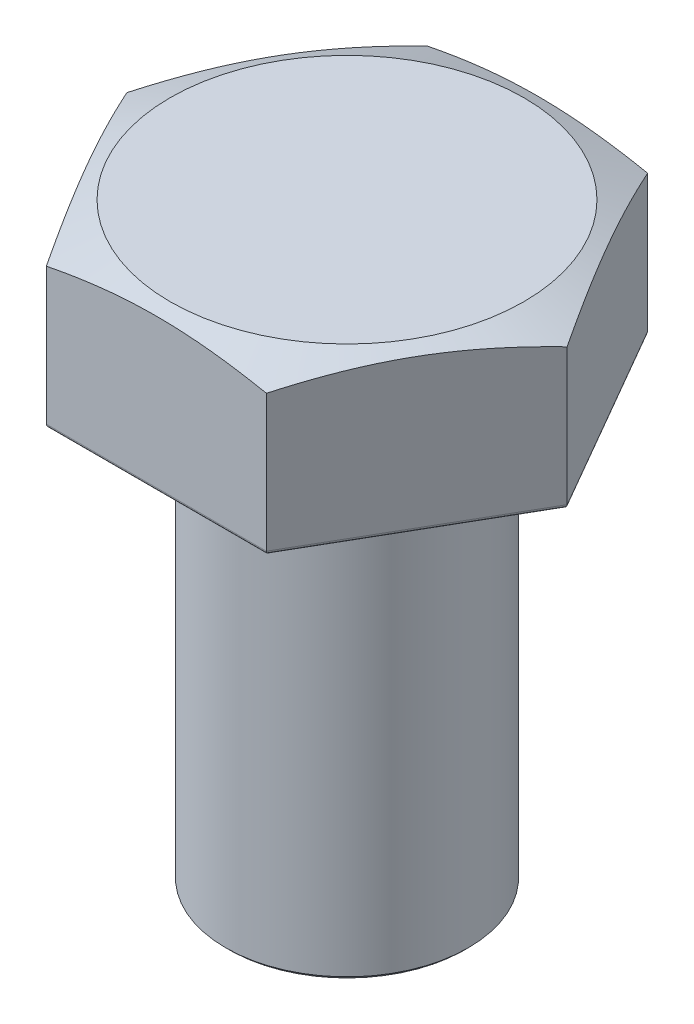
ISO-10303-21;
HEADER;
FILE_DESCRIPTION(('STEP AP214'),'2;1');
FILE_NAME('part.step','',(''),(''),'','','');
FILE_SCHEMA(('AUTOMOTIVE_DESIGN { 1 0 10303 214 1 1 1 1 }'));
ENDSEC;
DATA;
#1=APPLICATION_CONTEXT('core data for automotive mechanical design processes');
#2=APPLICATION_PROTOCOL_DEFINITION('international standard','automotive_design',2000,#1);
#3=PRODUCT_CONTEXT('',#1,'mechanical');
#4=PRODUCT('Part','Part','',(#3));
#5=PRODUCT_RELATED_PRODUCT_CATEGORY('part','',(#4));
#6=PRODUCT_DEFINITION_FORMATION('','',#4);
#7=PRODUCT_DEFINITION_CONTEXT('part definition',#1,'design');
#8=PRODUCT_DEFINITION('design','',#6,#7);
#9=PRODUCT_DEFINITION_SHAPE('','',#8);
#10=(LENGTH_UNIT() NAMED_UNIT(*) SI_UNIT(.MILLI.,.METRE.));
#11=(NAMED_UNIT(*) PLANE_ANGLE_UNIT() SI_UNIT($,.RADIAN.));
#12=(NAMED_UNIT(*) SI_UNIT($,.STERADIAN.) SOLID_ANGLE_UNIT());
#13=UNCERTAINTY_MEASURE_WITH_UNIT(LENGTH_MEASURE(1.E-05),#10,'distance_accuracy_value','');
#14=(GEOMETRIC_REPRESENTATION_CONTEXT(3) GLOBAL_UNCERTAINTY_ASSIGNED_CONTEXT((#13)) GLOBAL_UNIT_ASSIGNED_CONTEXT((#10,
#11,#12)) REPRESENTATION_CONTEXT('',''));
#15=CARTESIAN_POINT('',(0.,0.,0.));
#16=DIRECTION('',(0.,0.,1.));
#17=DIRECTION('',(1.,0.,0.));
#18=AXIS2_PLACEMENT_3D('',#15,#16,#17);
#19=CARTESIAN_POINT('',(6.35085296108599,9.09,10.9999999999999));
#20=DIRECTION('',(-0.866025403784442,0.,-0.499999999999995));
#21=DIRECTION('',(-0.499999999999995,0.,0.866025403784442));
#22=AXIS2_PLACEMENT_3D('',#19,#20,#21);
#23=PLANE('',#22);
#24=DIRECTION('',(0.,-1.,0.));
#25=VECTOR('',#24,1.);
#26=CARTESIAN_POINT('',(12.7017059221717,9.09,0.));
#27=LINE('',#26,#25);
#28=CARTESIAN_POINT('',(12.7017059221717,8.09,0.));
#29=VERTEX_POINT('',#28);
#30=CARTESIAN_POINT('',(12.7017059221717,0.200000000000001,0.));
#31=VERTEX_POINT('',#30);
#32=EDGE_CURVE('E128',#29,#31,#27,.T.);
#33=ORIENTED_EDGE('',*,*,#32,.F.);
#34=CARTESIAN_POINT('',(12.7018213922256,8.08995381134864,-0.0002));
#35=CARTESIAN_POINT('',(12.4776924324491,8.17961394521636,0.388002745780378));
#36=CARTESIAN_POINT('',(12.252829401687,8.26244440721102,0.777476939804257));
#37=CARTESIAN_POINT('',(11.801629871786,8.41185434176261,1.55897744994393));
#38=CARTESIAN_POINT('',(11.5752925856983,8.478424253155,1.95100512909514));
#39=CARTESIAN_POINT('',(11.1214902915673,8.59258796537094,2.73701375912146));
#40=CARTESIAN_POINT('',(10.8940257538736,8.64018910031331,3.13099389532697));
#41=CARTESIAN_POINT('',(10.4382735662335,8.71417288229393,3.92037983998036));
#42=CARTESIAN_POINT('',(10.2099861109051,8.74056025301229,4.31578531133984));
#43=CARTESIAN_POINT('',(9.75685496018894,8.77046054496113,5.10063148687234));
#44=CARTESIAN_POINT('',(9.53201755134767,8.77434879427317,5.49006130242755));
#45=CARTESIAN_POINT('',(9.08250060329672,8.76004126460187,6.26864749531511));
#46=CARTESIAN_POINT('',(8.85782108017261,8.74184349177624,6.65780384478642));
#47=CARTESIAN_POINT('',(8.40928992149079,8.68435397544348,7.43468260040108));
#48=CARTESIAN_POINT('',(8.18543786154101,8.64507522005964,7.82240574161306));
#49=CARTESIAN_POINT('',(7.73881363442427,8.54734222554435,8.59598159487045));
#50=CARTESIAN_POINT('',(7.51604136224307,8.48888989070653,8.98183448880585));
#51=CARTESIAN_POINT('',(7.21510990898177,8.39835118407707,9.50306305544998));
#52=CARTESIAN_POINT('',(7.13638157908874,8.37358583039961,9.63942452281974));
#53=CARTESIAN_POINT('',(6.97909897108727,8.32206300970569,9.91184599102523));
#54=CARTESIAN_POINT('',(6.90054466876976,8.29530584037184,10.0479060337923));
#55=CARTESIAN_POINT('',(6.74335416918599,8.23982077085785,10.3201679655385));
#56=CARTESIAN_POINT('',(6.66471850138683,8.21108689368401,10.4563689374538));
#57=CARTESIAN_POINT('',(6.5076063219117,8.15183219037019,10.7284952147926));
#58=CARTESIAN_POINT('',(6.42912982929638,8.12131116194849,10.8644204872021));
#59=CARTESIAN_POINT('',(6.35073749103215,8.08995381134869,11.0001999999999));
#60=B_SPLINE_CURVE_WITH_KNOTS('',3,(#34,#35,#36,#37,#38,#39,#40,#41,#42,#43,#44,#45,#46,#47,#48,
#49,#50,#51,#52,#53,#54,#55,#56,#57,#58,#59),.UNSPECIFIED.,.F.,.F.,(4,2,2,2,2,2,2,2,2,2,2,2,4),
(0.,1.3715079289317,2.74382037033854,4.1156017026003,5.48707749491719,6.83560698930991,
8.18425823288452,9.5320795163611,10.8797669765856,11.3579368757679,11.8360354540019,
12.3156492482444,12.7953174337137),.UNSPECIFIED.);
#61=CARTESIAN_POINT('',(6.35085296108588,8.09000000000008,10.9999999999999));
#62=VERTEX_POINT('',#61);
#63=EDGE_CURVE('E115',#29,#62,#60,.T.);
#64=ORIENTED_EDGE('',*,*,#63,.T.);
#65=DIRECTION('',(0.,-1.,0.));
#66=VECTOR('',#65,1.);
#67=CARTESIAN_POINT('',(6.35085296108599,9.09,10.9999999999999));
#68=LINE('',#67,#66);
#69=CARTESIAN_POINT('',(6.35085296108599,0.200000000000001,10.9999999999999));
#70=VERTEX_POINT('',#69);
#71=EDGE_CURVE('E68',#62,#70,#68,.T.);
#72=ORIENTED_EDGE('',*,*,#71,.T.);
#73=DIRECTION('',(0.499999999999995,0.,-0.866025403784442));
#74=VECTOR('',#73,1.);
#75=CARTESIAN_POINT('',(6.35085296108599,0.200000000000001,10.9999999999999));
#76=LINE('',#75,#74);
#77=EDGE_CURVE('E52',#70,#31,#76,.T.);
#78=ORIENTED_EDGE('',*,*,#77,.T.);
#79=EDGE_LOOP('',(#33,#64,#72,#78));
#80=FACE_BOUND('',#79,.T.);
#81=ADVANCED_FACE('F43',(#80),#23,.F.);
#82=CARTESIAN_POINT('',(12.7017059221717,9.09,0.));
#83=DIRECTION('',(-0.866025403784438,0.,0.500000000000001));
#84=DIRECTION('',(0.500000000000001,0.,0.866025403784438));
#85=AXIS2_PLACEMENT_3D('',#82,#83,#84);
#86=PLANE('',#85);
#87=DIRECTION('',(0.,-1.,0.));
#88=VECTOR('',#87,1.);
#89=CARTESIAN_POINT('',(6.35085296108584,9.09,-11.));
#90=LINE('',#89,#88);
#91=CARTESIAN_POINT('',(6.35085296108573,8.09000000000008,-11.));
#92=VERTEX_POINT('',#91);
#93=CARTESIAN_POINT('',(6.35085296108584,0.200000000000001,-11.));
#94=VERTEX_POINT('',#93);
#95=EDGE_CURVE('E129',#92,#94,#90,.T.);
#96=ORIENTED_EDGE('',*,*,#95,.F.);
#97=CARTESIAN_POINT('',(6.350737491032,8.08995381134869,-11.0002));
#98=CARTESIAN_POINT('',(6.57486645080845,8.17961394521642,-10.6119972542196));
#99=CARTESIAN_POINT('',(6.79972948157056,8.26244440721107,-10.2225230601957));
#100=CARTESIAN_POINT('',(7.25092901147153,8.41185434176266,-9.44102255005604));
#101=CARTESIAN_POINT('',(7.47726629755927,8.47842425315505,-9.04899487090482));
#102=CARTESIAN_POINT('',(7.93106859169033,8.59258796537098,-8.2629862408785));
#103=CARTESIAN_POINT('',(8.15853312938395,8.64018910031335,-7.86900610467299));
#104=CARTESIAN_POINT('',(8.6142853170241,8.71417288229396,-7.07962016001959));
#105=CARTESIAN_POINT('',(8.84257277235255,8.74056025301232,-6.68421468866011));
#106=CARTESIAN_POINT('',(9.29570392306869,8.77046054496115,-5.8993685131276));
#107=CARTESIAN_POINT('',(9.52054133190996,8.77434879427319,-5.50993869757239));
#108=CARTESIAN_POINT('',(9.97005827996092,8.76004126460187,-4.73135250468482));
#109=CARTESIAN_POINT('',(10.194737803085,8.74184349177624,-4.34219615521352));
#110=CARTESIAN_POINT('',(10.6432689617669,8.68435397544348,-3.56531739959885));
#111=CARTESIAN_POINT('',(10.8671210217167,8.64507522005964,-3.17759425838687));
#112=CARTESIAN_POINT('',(11.3137452488334,8.54734222554433,-2.40401840512947));
#113=CARTESIAN_POINT('',(11.5365175210146,8.48888989070651,-2.01816551119408));
#114=CARTESIAN_POINT('',(11.8374489742759,8.39835118407704,-1.49693694454994));
#115=CARTESIAN_POINT('',(11.9161773041689,8.37358583039958,-1.36057547718018));
#116=CARTESIAN_POINT('',(12.0734599121704,8.32206300970565,-1.08815400897468));
#117=CARTESIAN_POINT('',(12.1520142144879,8.2953058403718,-0.952093966207622));
#118=CARTESIAN_POINT('',(12.3092047140717,8.2398207708578,-0.67983203446139));
#119=CARTESIAN_POINT('',(12.3878403818709,8.21108689368396,-0.543631062546127));
#120=CARTESIAN_POINT('',(12.544952561346,8.15183219037013,-0.271504785207316));
#121=CARTESIAN_POINT('',(12.6234290539613,8.12131116194843,-0.135579512797765));
#122=CARTESIAN_POINT('',(12.7018213922256,8.08995381134863,0.000200000000000106));
#123=B_SPLINE_CURVE_WITH_KNOTS('',3,(#97,#98,#99,#100,#101,#102,#103,#104,#105,#106,#107,#108,
#109,#110,#111,#112,#113,#114,#115,#116,#117,#118,#119,#120,#121,#122),.UNSPECIFIED.,.F.,.F.,(4,
2,2,2,2,2,2,2,2,2,2,2,4),(0.,1.37150792893172,2.74382037033857,4.11560170260035,
5.48707749491724,6.83560698930998,8.1842582328846,9.53207951636119,10.8797669765857,
11.357936875768,11.836035454002,12.3156492482445,12.7953174337138),.UNSPECIFIED.);
#124=EDGE_CURVE('E118',#92,#29,#123,.T.);
#125=ORIENTED_EDGE('',*,*,#124,.T.);
#126=ORIENTED_EDGE('',*,*,#32,.T.);
#127=DIRECTION('',(-0.500000000000001,0.,-0.866025403784438));
#128=VECTOR('',#127,1.);
#129=CARTESIAN_POINT('',(12.7017059221717,0.200000000000001,0.));
#130=LINE('',#129,#128);
#131=EDGE_CURVE('E148',#31,#94,#130,.T.);
#132=ORIENTED_EDGE('',*,*,#131,.T.);
#133=EDGE_LOOP('',(#96,#125,#126,#132));
#134=FACE_BOUND('',#133,.T.);
#135=ADVANCED_FACE('F126',(#134),#86,.F.);
#136=CARTESIAN_POINT('',(6.35085296108584,9.09,-11.));
#137=DIRECTION('',(0.,0.,1.));
#138=DIRECTION('',(1.,0.,0.));
#139=AXIS2_PLACEMENT_3D('',#136,#137,#138);
#140=PLANE('',#139);
#141=DIRECTION('',(0.,-1.,0.));
#142=VECTOR('',#141,1.);
#143=CARTESIAN_POINT('',(-6.35085296108591,9.09,-10.9999999999999));
#144=LINE('',#143,#142);
#145=CARTESIAN_POINT('',(-6.35085296108592,8.09000000000024,-10.9999999999998));
#146=VERTEX_POINT('',#145);
#147=CARTESIAN_POINT('',(-6.35085296108591,0.200000000000001,-10.9999999999999));
#148=VERTEX_POINT('',#147);
#149=EDGE_CURVE('E139',#146,#148,#144,.T.);
#150=ORIENTED_EDGE('',*,*,#149,.F.);
#151=CARTESIAN_POINT('',(-19.0920628634968,4.35699424746426,-10.9999999999999));
#152=CARTESIAN_POINT('',(-18.7502694604869,4.47544979688179,-10.9999999999999));
#153=CARTESIAN_POINT('',(-18.4082336815767,4.59320901860638,-10.9999999999999));
#154=CARTESIAN_POINT('',(-17.723607493816,4.82711581388004,-10.9999999999999));
#155=CARTESIAN_POINT('',(-17.3810170789259,4.94326336974554,-10.9999999999999));
#156=CARTESIAN_POINT('',(-16.6951555374354,5.17374663821273,-10.9999999999999));
#157=CARTESIAN_POINT('',(-16.3518842962103,5.28808201024731,-10.9999999999999));
#158=CARTESIAN_POINT('',(-15.6646478146989,5.51464274371641,-10.9999999999999));
#159=CARTESIAN_POINT('',(-15.3206825761013,5.62686811027871,-10.9999999999999));
#160=CARTESIAN_POINT('',(-14.2799759088016,5.96238537126558,-10.9999999999999));
#161=CARTESIAN_POINT('',(-13.5820238253784,6.18194924746087,-10.9999999999999));
#162=CARTESIAN_POINT('',(-12.1820867322238,6.60779924544584,-10.9999999999999));
#163=CARTESIAN_POINT('',(-11.4801018876449,6.81408590681087,-10.9999999999999));
#164=CARTESIAN_POINT('',(-10.0962461974106,7.20144595288912,-10.9999999999999));
#165=CARTESIAN_POINT('',(-9.41455593279752,7.38315792332834,-10.9999999999999));
#166=CARTESIAN_POINT('',(-8.04535011692229,7.72362933781627,-10.9999999999999));
#167=CARTESIAN_POINT('',(-7.35783415395924,7.88238714513436,-10.9999999999999));
#168=CARTESIAN_POINT('',(-5.97974274102835,8.16808110863116,-10.9999999999999));
#169=CARTESIAN_POINT('',(-5.28920159968097,8.29517787896604,-10.9999999999999));
#170=CARTESIAN_POINT('',(-4.24875948494421,8.4556067421732,-10.9999999999999));
#171=CARTESIAN_POINT('',(-3.90117452381317,8.50404690394513,-10.9999999999999));
#172=CARTESIAN_POINT('',(-3.20463211473868,8.58968040163076,-10.9999999999999));
#173=CARTESIAN_POINT('',(-2.85567477184692,8.62687458204627,-10.9999999999999));
#174=CARTESIAN_POINT('',(-2.13851881799007,8.69059597367345,-10.9999999999999));
#175=CARTESIAN_POINT('',(-1.77026144160484,8.71646946692967,-10.9999999999999));
#176=CARTESIAN_POINT('',(-1.03300875528732,8.75374360896458,-11.));
#177=CARTESIAN_POINT('',(-0.664013448989059,8.76514432884151,-11.));
#178=CARTESIAN_POINT('',(0.0741191067442304,8.77305756517621,-11.));
#179=CARTESIAN_POINT('',(0.443256347473936,8.76957088264763,-11.));
#180=CARTESIAN_POINT('',(1.18109209287857,8.7478400215262,-11.));
#181=CARTESIAN_POINT('',(1.5497905953851,8.72959577029695,-11.));
#182=CARTESIAN_POINT('',(2.28714058806989,8.6789347935946,-11.));
#183=CARTESIAN_POINT('',(2.65578960598651,8.64648237776389,-11.));
#184=CARTESIAN_POINT('',(3.39167722983285,8.56846483606922,-11.));
#185=CARTESIAN_POINT('',(3.7589158205191,8.52289956888727,-11.));
#186=CARTESIAN_POINT('',(4.85828942974391,8.36848432939545,-11.));
#187=CARTESIAN_POINT('',(5.58797178943158,8.24192324599117,-11.));
#188=CARTESIAN_POINT('',(6.67774090401649,8.02492545058698,-11.));
#189=CARTESIAN_POINT('',(7.04065256666073,7.9479542958282,-11.));
#190=CARTESIAN_POINT('',(7.76474792907975,7.78624392986768,-11.));
#191=CARTESIAN_POINT('',(8.12593166107067,7.70150486409216,-11.));
#192=CARTESIAN_POINT('',(8.8466258105891,7.52541732635702,-11.));
#193=CARTESIAN_POINT('',(9.20613642389684,7.4340696495133,-11.));
#194=CARTESIAN_POINT('',(9.9236811042603,7.24573485871478,-11.));
#195=CARTESIAN_POINT('',(10.2817151401596,7.14874762640816,-11.));
#196=CARTESIAN_POINT('',(11.3535410765118,6.85070449392688,-11.));
#197=CARTESIAN_POINT('',(12.0653435832118,6.64249560534918,-11.));
#198=CARTESIAN_POINT('',(13.4846996404256,6.21225527296768,-11.));
#199=CARTESIAN_POINT('',(14.1922532774686,5.99022411171192,-11.));
#200=CARTESIAN_POINT('',(15.2500993116925,5.64980849170969,-11.));
#201=CARTESIAN_POINT('',(15.6016384327792,5.53527589221507,-11.));
#202=CARTESIAN_POINT('',(16.3039280236474,5.30401068369644,-11.));
#203=CARTESIAN_POINT('',(16.6546786145039,5.18727844251664,-11.));
#204=CARTESIAN_POINT('',(17.3534949637619,4.9525759007572,-11.));
#205=CARTESIAN_POINT('',(17.7015644723994,4.83461674987695,-11.));
#206=CARTESIAN_POINT('',(18.3971937367102,4.59700951920493,-11.));
#207=CARTESIAN_POINT('',(18.7447533941905,4.47736115183579,-11.));
#208=CARTESIAN_POINT('',(19.0920628634967,4.35699424746381,-11.));
#209=B_SPLINE_CURVE_WITH_KNOTS('',3,(#151,#152,#153,#154,#155,#156,#157,#158,#159,#160,#161,
#162,#163,#164,#165,#166,#167,#168,#169,#170,#171,#172,#173,#174,#175,#176,#177,#178,#179,#180,
#181,#182,#183,#184,#185,#186,#187,#188,#189,#190,#191,#192,#193,#194,#195,#196,#197,#198,#199,
#200,#201,#202,#203,#204,#205,#206,#207,#208),.UNSPECIFIED.,.F.,.F.,(4,2,2,2,2,2,2,2,2,2,2,2,2,
2,2,2,2,2,2,2,2,2,2,2,2,2,2,2,4),(0.,1.08521491960177,2.1704417370289,3.25587014104849,
4.34129590689948,6.53621400499467,8.7310428469847,10.8472262264985,12.9635604246589,
15.0689293567622,16.1216089436137,17.1742094612667,18.2814338332416,19.3886527659002,
20.495812125622,21.6029769347901,22.7129390004232,23.8229130286326,26.043192842842,
27.1561002102844,28.2689867467891,29.3817396081739,30.4945158302485,32.7191818935287,
34.943802496211,36.0529750229011,37.1619636814164,38.2645022149976,39.3672307673445),.UNSPECIFIED.);
#210=EDGE_CURVE('E130',#146,#92,#209,.T.);
#211=ORIENTED_EDGE('',*,*,#210,.T.);
#212=ORIENTED_EDGE('',*,*,#95,.T.);
#213=DIRECTION('',(-1.,0.,0.));
#214=VECTOR('',#213,1.);
#215=CARTESIAN_POINT('',(6.35085296108584,0.200000000000001,-11.));
#216=LINE('',#215,#214);
#217=EDGE_CURVE('E166',#94,#148,#216,.T.);
#218=ORIENTED_EDGE('',*,*,#217,.T.);
#219=EDGE_LOOP('',(#150,#211,#212,#218));
#220=FACE_BOUND('',#219,.T.);
#221=ADVANCED_FACE('F218',(#220),#140,.F.);
#222=CARTESIAN_POINT('',(-6.35085296108591,9.09,-10.9999999999999));
#223=DIRECTION('',(0.866025403784442,0.,0.499999999999995));
#224=DIRECTION('',(0.499999999999995,0.,-0.866025403784442));
#225=AXIS2_PLACEMENT_3D('',#222,#223,#224);
#226=PLANE('',#225);
#227=DIRECTION('',(0.,-1.,0.));
#228=VECTOR('',#227,1.);
#229=CARTESIAN_POINT('',(-12.7017059221717,9.09,0.));
#230=LINE('',#229,#228);
#231=CARTESIAN_POINT('',(-12.7017059221715,8.09000000000032,2.73218947466347E-13));
#232=VERTEX_POINT('',#231);
#233=CARTESIAN_POINT('',(-12.7017059221717,0.200000000000001,0.));
#234=VERTEX_POINT('',#233);
#235=EDGE_CURVE('E200',#232,#234,#230,.T.);
#236=ORIENTED_EDGE('',*,*,#235,.F.);
#237=CARTESIAN_POINT('',(-12.7018213922256,8.08995381134888,0.000200000000088696));
#238=CARTESIAN_POINT('',(-12.4776924324491,8.1796139452166,-0.3880027457803));
#239=CARTESIAN_POINT('',(-12.252829401687,8.26244440721126,-0.77747693980419));
#240=CARTESIAN_POINT('',(-11.801629871786,8.41185434176284,-1.55897744994388));
#241=CARTESIAN_POINT('',(-11.5752925856983,8.47842425315523,-1.9510051290951));
#242=CARTESIAN_POINT('',(-11.1214902915672,8.59258796537116,-2.73701375912145));
#243=CARTESIAN_POINT('',(-10.8940257538736,8.64018910031352,-3.13099389532697));
#244=CARTESIAN_POINT('',(-10.4382735662334,8.71417288229413,-3.92037983998038));
#245=CARTESIAN_POINT('',(-10.209986110905,8.74056025301249,-4.31578531133987));
#246=CARTESIAN_POINT('',(-9.75685496018885,8.77046054496131,-5.10063148687239));
#247=CARTESIAN_POINT('',(-9.53201755134758,8.77434879427335,-5.49006130242761));
#248=CARTESIAN_POINT('',(-9.08250060329662,8.76004126460203,-6.26864749531519));
#249=CARTESIAN_POINT('',(-8.85782108017251,8.7418434917764,-6.65780384478651));
#250=CARTESIAN_POINT('',(-8.40928992149067,8.68435397544364,-7.43468260040119));
#251=CARTESIAN_POINT('',(-8.18543786154089,8.64507522005979,-7.82240574161318));
#252=CARTESIAN_POINT('',(-7.73881363442413,8.54734222554448,-8.5959815948706));
#253=CARTESIAN_POINT('',(-7.51604136224293,8.48888989070665,-8.981834488806));
#254=CARTESIAN_POINT('',(-7.21510990898163,8.39835118407719,-9.50306305545013));
#255=CARTESIAN_POINT('',(-7.13638157908861,8.37358583039972,-9.63942452281988));
#256=CARTESIAN_POINT('',(-6.97909897108714,8.32206300970581,-9.91184599102536));
#257=CARTESIAN_POINT('',(-6.90054466876964,8.29530584037196,-10.0479060337924));
#258=CARTESIAN_POINT('',(-6.74335416918588,8.23982077085797,-10.3201679655386));
#259=CARTESIAN_POINT('',(-6.66471850138673,8.21108689368412,-10.4563689374539));
#260=CARTESIAN_POINT('',(-6.50760632191161,8.15183219037031,-10.7284952147926));
#261=CARTESIAN_POINT('',(-6.42912982929629,8.12131116194861,-10.8644204872022));
#262=CARTESIAN_POINT('',(-6.35073749103208,8.08995381134881,-11.0001999999999));
#263=B_SPLINE_CURVE_WITH_KNOTS('',3,(#237,#238,#239,#240,#241,#242,#243,#244,#245,#246,#247,
#248,#249,#250,#251,#252,#253,#254,#255,#256,#257,#258,#259,#260,#261,#262),.UNSPECIFIED.,.F.,
.F.,(4,2,2,2,2,2,2,2,2,2,2,2,4),(0.,1.37150792893174,2.74382037033861,4.11560170260041,
5.48707749491733,6.83560698931009,8.18425823288473,9.53207951636135,10.8797669765859,
11.3579368757681,11.8360354540021,12.3156492482445,12.7953174337138),.UNSPECIFIED.);
#264=EDGE_CURVE('E215',#232,#146,#263,.T.);
#265=ORIENTED_EDGE('',*,*,#264,.T.);
#266=ORIENTED_EDGE('',*,*,#149,.T.);
#267=DIRECTION('',(-0.499999999999995,0.,0.866025403784442));
#268=VECTOR('',#267,1.);
#269=CARTESIAN_POINT('',(-6.35085296108591,0.200000000000001,-10.9999999999999));
#270=LINE('',#269,#268);
#271=EDGE_CURVE('E169',#148,#234,#270,.T.);
#272=ORIENTED_EDGE('',*,*,#271,.T.);
#273=EDGE_LOOP('',(#236,#265,#266,#272));
#274=FACE_BOUND('',#273,.T.);
#275=ADVANCED_FACE('F213',(#274),#226,.F.);
#276=CARTESIAN_POINT('',(-12.7017059221717,9.09,0.));
#277=DIRECTION('',(0.866025403784435,0.,-0.500000000000007));
#278=DIRECTION('',(-0.500000000000007,0.,-0.866025403784435));
#279=AXIS2_PLACEMENT_3D('',#276,#277,#278);
#280=PLANE('',#279);
#281=DIRECTION('',(0.,-1.,0.));
#282=VECTOR('',#281,1.);
#283=CARTESIAN_POINT('',(-6.35085296108576,9.09,11.));
#284=LINE('',#283,#282);
#285=CARTESIAN_POINT('',(-6.35085296108576,8.09,11.));
#286=VERTEX_POINT('',#285);
#287=CARTESIAN_POINT('',(-6.35085296108576,0.200000000000001,11.));
#288=VERTEX_POINT('',#287);
#289=EDGE_CURVE('E198',#286,#288,#284,.T.);
#290=ORIENTED_EDGE('',*,*,#289,.F.);
#291=CARTESIAN_POINT('',(-6.35073749103192,8.08995381134882,11.0002));
#292=CARTESIAN_POINT('',(-6.57486645080838,8.17961394521654,10.6119972542196));
#293=CARTESIAN_POINT('',(-6.79972948157049,8.2624444072112,10.2225230601958));
#294=CARTESIAN_POINT('',(-7.25092901147147,8.4118543417628,9.44102255005608));
#295=CARTESIAN_POINT('',(-7.47726629755921,8.47842425315519,9.04899487090486));
#296=CARTESIAN_POINT('',(-7.93106859169029,8.59258796537113,8.26298624087853));
#297=CARTESIAN_POINT('',(-8.15853312938391,8.6401891003135,7.86900610467302));
#298=CARTESIAN_POINT('',(-8.61428531702407,8.71417288229411,7.07962016001961));
#299=CARTESIAN_POINT('',(-8.84257277235252,8.74056025301247,6.68421468866013));
#300=CARTESIAN_POINT('',(-9.29570392306868,8.77046054496131,5.89936851312762));
#301=CARTESIAN_POINT('',(-9.52054133190995,8.77434879427335,5.50993869757241));
#302=CARTESIAN_POINT('',(-9.97005827996092,8.76004126460204,4.73135250468483));
#303=CARTESIAN_POINT('',(-10.194737803085,8.74184349177642,4.34219615521353));
#304=CARTESIAN_POINT('',(-10.6432689617669,8.68435397544366,3.56531739959885));
#305=CARTESIAN_POINT('',(-10.8671210217167,8.64507522005982,3.17759425838687));
#306=CARTESIAN_POINT('',(-11.3137452488334,8.54734222554452,2.40401840512946));
#307=CARTESIAN_POINT('',(-11.5365175210146,8.4888898907067,2.01816551119407));
#308=CARTESIAN_POINT('',(-11.837448974276,8.39835118407724,1.49693694454994));
#309=CARTESIAN_POINT('',(-11.916177304169,8.37358583039978,1.36057547718018));
#310=CARTESIAN_POINT('',(-12.0734599121704,8.32206300970586,1.0881540089747));
#311=CARTESIAN_POINT('',(-12.152014214488,8.29530584037202,0.952093966207652));
#312=CARTESIAN_POINT('',(-12.3092047140717,8.23982077085803,0.679832034461437));
#313=CARTESIAN_POINT('',(-12.3878403818709,8.21108689368418,0.543631062546182));
#314=CARTESIAN_POINT('',(-12.544952561346,8.15183219037037,0.271504785207388));
#315=CARTESIAN_POINT('',(-12.6234290539613,8.12131116194866,0.135579512797846));
#316=CARTESIAN_POINT('',(-12.7018213922256,8.08995381134888,-0.000199999999911253));
#317=B_SPLINE_CURVE_WITH_KNOTS('',3,(#291,#292,#293,#294,#295,#296,#297,#298,#299,#300,#301,
#302,#303,#304,#305,#306,#307,#308,#309,#310,#311,#312,#313,#314,#315,#316),.UNSPECIFIED.,.F.,
.F.,(4,2,2,2,2,2,2,2,2,2,2,2,4),(0.,1.37150792893173,2.74382037033859,4.11560170260039,
5.4870774949173,6.83560698931004,8.18425823288468,9.53207951636129,10.8797669765858,
11.3579368757681,11.8360354540021,12.3156492482445,12.7953174337138),.UNSPECIFIED.);
#318=EDGE_CURVE('E60',#286,#232,#317,.T.);
#319=ORIENTED_EDGE('',*,*,#318,.T.);
#320=ORIENTED_EDGE('',*,*,#235,.T.);
#321=DIRECTION('',(0.500000000000007,0.,0.866025403784435));
#322=VECTOR('',#321,1.);
#323=CARTESIAN_POINT('',(-12.7017059221717,0.200000000000001,0.));
#324=LINE('',#323,#322);
#325=EDGE_CURVE('E172',#234,#288,#324,.T.);
#326=ORIENTED_EDGE('',*,*,#325,.T.);
#327=EDGE_LOOP('',(#290,#319,#320,#326));
#328=FACE_BOUND('',#327,.T.);
#329=ADVANCED_FACE('F242',(#328),#280,.F.);
#330=CARTESIAN_POINT('',(-6.35085296108576,9.09,11.));
#331=DIRECTION('',(0.,0.,-1.));
#332=DIRECTION('',(-1.,0.,0.));
#333=AXIS2_PLACEMENT_3D('',#330,#331,#332);
#334=PLANE('',#333);
#335=ORIENTED_EDGE('',*,*,#71,.F.);
#336=CARTESIAN_POINT('',(19.0920628634969,4.35699424746381,10.9999999999998));
#337=CARTESIAN_POINT('',(18.750269460487,4.47544979688136,10.9999999999998));
#338=CARTESIAN_POINT('',(18.4082336815768,4.59320901860595,10.9999999999998));
#339=CARTESIAN_POINT('',(17.7236074938161,4.82711581387962,10.9999999999998));
#340=CARTESIAN_POINT('',(17.381017078926,4.94326336974514,10.9999999999998));
#341=CARTESIAN_POINT('',(16.6951555374355,5.17374663821234,10.9999999999998));
#342=CARTESIAN_POINT('',(16.3518842962104,5.28808201024693,10.9999999999998));
#343=CARTESIAN_POINT('',(15.664647814699,5.51464274371605,10.9999999999998));
#344=CARTESIAN_POINT('',(15.3206825761014,5.62686811027835,10.9999999999998));
#345=CARTESIAN_POINT('',(14.2799759088017,5.96238537126524,10.9999999999998));
#346=CARTESIAN_POINT('',(13.5820238253785,6.18194924746055,10.9999999999998));
#347=CARTESIAN_POINT('',(12.1820867322239,6.60779924544555,10.9999999999998));
#348=CARTESIAN_POINT('',(11.4801018876451,6.81408590681061,10.9999999999998));
#349=CARTESIAN_POINT('',(10.0962461974108,7.20144595288889,10.9999999999999));
#350=CARTESIAN_POINT('',(9.41455593279772,7.38315792332812,10.9999999999999));
#351=CARTESIAN_POINT('',(8.0453501169225,7.72362933781608,10.9999999999999));
#352=CARTESIAN_POINT('',(7.35783415395946,7.88238714513418,10.9999999999999));
#353=CARTESIAN_POINT('',(5.97974274102858,8.16808110863101,10.9999999999999));
#354=CARTESIAN_POINT('',(5.2892015996812,8.29517787896592,10.9999999999999));
#355=CARTESIAN_POINT('',(4.24875948494445,8.4556067421731,10.9999999999999));
#356=CARTESIAN_POINT('',(3.90117452381342,8.50404690394504,10.9999999999999));
#357=CARTESIAN_POINT('',(3.20463211473893,8.58968040163068,10.9999999999999));
#358=CARTESIAN_POINT('',(2.85567477184717,8.6268745820462,10.9999999999999));
#359=CARTESIAN_POINT('',(2.13851881799032,8.6905959736734,10.9999999999999));
#360=CARTESIAN_POINT('',(1.7702614416051,8.71646946692962,10.9999999999999));
#361=CARTESIAN_POINT('',(1.03300875528758,8.75374360896456,10.9999999999999));
#362=CARTESIAN_POINT('',(0.664013448989321,8.76514432884149,10.9999999999999));
#363=CARTESIAN_POINT('',(-0.0741191067439651,8.77305756517621,11.));
#364=CARTESIAN_POINT('',(-0.443256347473669,8.76957088264764,11.));
#365=CARTESIAN_POINT('',(-1.1810920928783,8.74784002152623,11.));
#366=CARTESIAN_POINT('',(-1.54979059538483,8.72959577029699,11.));
#367=CARTESIAN_POINT('',(-2.28714058806962,8.67893479359465,11.));
#368=CARTESIAN_POINT('',(-2.65578960598623,8.64648237776396,11.));
#369=CARTESIAN_POINT('',(-3.39167722983257,8.56846483606931,11.));
#370=CARTESIAN_POINT('',(-3.75891582051882,8.52289956888737,11.));
#371=CARTESIAN_POINT('',(-4.85828942974363,8.36848432939557,11.));
#372=CARTESIAN_POINT('',(-5.5879717894313,8.24192324599131,11.));
#373=CARTESIAN_POINT('',(-6.67774090401622,8.02492545058715,11.));
#374=CARTESIAN_POINT('',(-7.04065256666045,7.94795429582838,11.));
#375=CARTESIAN_POINT('',(-7.76474792907947,7.78624392986788,11.));
#376=CARTESIAN_POINT('',(-8.12593166107039,7.70150486409237,11.));
#377=CARTESIAN_POINT('',(-8.84662581058883,7.52541732635725,11.));
#378=CARTESIAN_POINT('',(-9.20613642389656,7.43406964951353,11.));
#379=CARTESIAN_POINT('',(-9.92368110426002,7.24573485871504,11.0000000000001));
#380=CARTESIAN_POINT('',(-10.2817151401593,7.14874762640842,11.0000000000001));
#381=CARTESIAN_POINT('',(-11.3535410765115,6.85070449392718,11.0000000000001));
#382=CARTESIAN_POINT('',(-12.0653435832115,6.64249560534949,11.0000000000001));
#383=CARTESIAN_POINT('',(-13.4846996404253,6.21225527296803,11.0000000000001));
#384=CARTESIAN_POINT('',(-14.1922532774683,5.99022411171229,11.0000000000001));
#385=CARTESIAN_POINT('',(-15.2500993116922,5.64980849171008,11.0000000000001));
#386=CARTESIAN_POINT('',(-15.6016384327789,5.53527589221546,11.0000000000001));
#387=CARTESIAN_POINT('',(-16.3039280236472,5.30401068369685,11.0000000000001));
#388=CARTESIAN_POINT('',(-16.6546786145037,5.18727844251706,11.0000000000001));
#389=CARTESIAN_POINT('',(-17.3534949637617,4.95257590075763,11.0000000000001));
#390=CARTESIAN_POINT('',(-17.7015644723993,4.83461674987738,11.0000000000001));
#391=CARTESIAN_POINT('',(-18.3971937367101,4.59700951920537,11.0000000000001));
#392=CARTESIAN_POINT('',(-18.7447533941904,4.47736115183623,11.0000000000001));
#393=CARTESIAN_POINT('',(-19.0920628634967,4.35699424746426,11.0000000000002));
#394=B_SPLINE_CURVE_WITH_KNOTS('',3,(#336,#337,#338,#339,#340,#341,#342,#343,#344,#345,#346,
#347,#348,#349,#350,#351,#352,#353,#354,#355,#356,#357,#358,#359,#360,#361,#362,#363,#364,#365,
#366,#367,#368,#369,#370,#371,#372,#373,#374,#375,#376,#377,#378,#379,#380,#381,#382,#383,#384,
#385,#386,#387,#388,#389,#390,#391,#392,#393),.UNSPECIFIED.,.F.,.F.,(4,2,2,2,2,2,2,2,2,2,2,2,2,
2,2,2,2,2,2,2,2,2,2,2,2,2,2,2,4),(0.,1.08521491960177,2.17044173702889,3.25587014104848,
4.34129590689946,6.53621400499464,8.73104284698465,10.8472262264984,12.9635604246588,
15.0689293567621,16.1216089436136,17.1742094612666,18.2814338332415,19.3886527659001,
20.4958121256219,21.60297693479,22.7129390004231,23.8229130286325,26.0431928428419,
27.1561002102843,28.268986746789,29.3817396081738,30.4945158302484,32.7191818935286,
34.9438024962108,36.0529750229009,37.1619636814163,38.2645022149976,39.3672307673445),.UNSPECIFIED.);
#395=EDGE_CURVE('E120',#62,#286,#394,.T.);
#396=ORIENTED_EDGE('',*,*,#395,.T.);
#397=ORIENTED_EDGE('',*,*,#289,.T.);
#398=DIRECTION('',(1.,0.,0.));
#399=VECTOR('',#398,1.);
#400=CARTESIAN_POINT('',(-6.35085296108576,0.200000000000001,11.));
#401=LINE('',#400,#399);
#402=EDGE_CURVE('E175',#288,#70,#401,.T.);
#403=ORIENTED_EDGE('',*,*,#402,.T.);
#404=EDGE_LOOP('',(#335,#396,#397,#403));
#405=FACE_BOUND('',#404,.T.);
#406=ADVANCED_FACE('F239',(#405),#334,.F.);
#407=CARTESIAN_POINT('',(0.,0.,0.));
#408=DIRECTION('',(0.,1.,0.));
#409=DIRECTION('',(0.,0.,1.));
#410=AXIS2_PLACEMENT_3D('',#407,#408,#409);
#411=PLANE('',#410);
#412=DIRECTION('',(-1.,0.,0.));
#413=VECTOR('',#412,1.);
#414=CARTESIAN_POINT('',(0.,0.,-10.8));
#415=LINE('',#414,#413);
#416=CARTESIAN_POINT('',(-6.23538290724799,0.,-10.7999999999999));
#417=VERTEX_POINT('',#416);
#418=CARTESIAN_POINT('',(6.23538290724791,0.,-10.8));
#419=VERTEX_POINT('',#418);
#420=EDGE_CURVE('E161',#417,#419,#415,.F.);
#421=ORIENTED_EDGE('',*,*,#420,.T.);
#422=DIRECTION('',(-0.500000000000001,0.,-0.866025403784438));
#423=VECTOR('',#422,1.);
#424=CARTESIAN_POINT('',(9.35307436087189,0.,-5.39999999999999));
#425=LINE('',#424,#423);
#426=CARTESIAN_POINT('',(12.4707658144959,0.,0.));
#427=VERTEX_POINT('',#426);
#428=EDGE_CURVE('E163',#419,#427,#425,.F.);
#429=ORIENTED_EDGE('',*,*,#428,.T.);
#430=DIRECTION('',(0.499999999999995,0.,-0.866025403784442));
#431=VECTOR('',#430,1.);
#432=CARTESIAN_POINT('',(9.35307436087197,0.,5.39999999999994));
#433=LINE('',#432,#431);
#434=CARTESIAN_POINT('',(6.23538290724806,0.,10.7999999999999));
#435=VERTEX_POINT('',#434);
#436=EDGE_CURVE('E153',#427,#435,#433,.F.);
#437=ORIENTED_EDGE('',*,*,#436,.T.);
#438=DIRECTION('',(1.,0.,0.));
#439=VECTOR('',#438,1.);
#440=CARTESIAN_POINT('',(1.12099983876678E-13,0.,10.8));
#441=LINE('',#440,#439);
#442=CARTESIAN_POINT('',(-6.23538290724784,0.,10.8));
#443=VERTEX_POINT('',#442);
#444=EDGE_CURVE('E155',#435,#443,#441,.F.);
#445=ORIENTED_EDGE('',*,*,#444,.T.);
#446=DIRECTION('',(0.500000000000007,0.,0.866025403784435));
#447=VECTOR('',#446,1.);
#448=CARTESIAN_POINT('',(-9.35307436087186,0.,5.40000000000005));
#449=LINE('',#448,#447);
#450=CARTESIAN_POINT('',(-12.4707658144959,0.,0.));
#451=VERTEX_POINT('',#450);
#452=EDGE_CURVE('E157',#443,#451,#449,.F.);
#453=ORIENTED_EDGE('',*,*,#452,.T.);
#454=DIRECTION('',(-0.499999999999995,0.,0.866025403784442));
#455=VECTOR('',#454,1.);
#456=CARTESIAN_POINT('',(-9.35307436087193,0.,-5.39999999999992));
#457=LINE('',#456,#455);
#458=EDGE_CURVE('E159',#451,#417,#457,.F.);
#459=ORIENTED_EDGE('',*,*,#458,.T.);
#460=EDGE_LOOP('',(#421,#429,#437,#445,#453,#459));
#461=FACE_BOUND('',#460,.T.);
#462=CARTESIAN_POINT('',(0.,0.,0.));
#463=DIRECTION('',(0.,1.,0.));
#464=DIRECTION('',(0.,0.,1.));
#465=AXIS2_PLACEMENT_3D('',#462,#463,#464);
#466=CIRCLE('',#465,7.28284271247461);
#467=CARTESIAN_POINT('',(0.,0.,7.28284271247461));
#468=VERTEX_POINT('',#467);
#469=EDGE_CURVE('E150',#468,#468,#466,.T.);
#470=ORIENTED_EDGE('',*,*,#469,.T.);
#471=EDGE_LOOP('',(#470));
#472=FACE_BOUND('',#471,.T.);
#473=ADVANCED_FACE('F227',(#461,#472),#411,.F.);
#474=CARTESIAN_POINT('',(0.,-25.,0.));
#475=DIRECTION('',(0.,1.,0.));
#476=DIRECTION('',(0.,0.,1.));
#477=AXIS2_PLACEMENT_3D('',#474,#475,#476);
#478=CYLINDRICAL_SURFACE('',#477,7.);
#479=CARTESIAN_POINT('',(0.,-24.8,0.));
#480=DIRECTION('',(0.,-1.,0.));
#481=DIRECTION('',(0.,0.,-1.));
#482=AXIS2_PLACEMENT_3D('',#479,#480,#481);
#483=CIRCLE('',#482,7.);
#484=CARTESIAN_POINT('',(0.,-24.8,-7.));
#485=VERTEX_POINT('',#484);
#486=EDGE_CURVE('E145',#485,#485,#483,.F.);
#487=ORIENTED_EDGE('',*,*,#486,.T.);
#488=EDGE_LOOP('',(#487));
#489=FACE_BOUND('',#488,.T.);
#490=CARTESIAN_POINT('',(0.,-0.199999999999988,0.));
#491=DIRECTION('',(0.,1.,0.));
#492=DIRECTION('',(0.,0.,1.));
#493=AXIS2_PLACEMENT_3D('',#490,#491,#492);
#494=CIRCLE('',#493,7.);
#495=CARTESIAN_POINT('',(0.,-0.199999999999988,7.));
#496=VERTEX_POINT('',#495);
#497=EDGE_CURVE('E137',#496,#496,#494,.F.);
#498=ORIENTED_EDGE('',*,*,#497,.T.);
#499=EDGE_LOOP('',(#498));
#500=FACE_BOUND('',#499,.T.);
#501=ADVANCED_FACE('F332',(#489,#500),#478,.T.);
#502=CARTESIAN_POINT('',(0.,-25.,0.));
#503=DIRECTION('',(0.,-1.,0.));
#504=DIRECTION('',(0.,0.,-1.));
#505=AXIS2_PLACEMENT_3D('',#502,#503,#504);
#506=PLANE('',#505);
#507=CARTESIAN_POINT('',(0.,-25.,0.));
#508=DIRECTION('',(0.,-1.,0.));
#509=DIRECTION('',(0.,0.,-1.));
#510=AXIS2_PLACEMENT_3D('',#507,#508,#509);
#511=CIRCLE('',#510,6.79999999999999);
#512=CARTESIAN_POINT('',(0.,-25.,-6.79999999999999));
#513=VERTEX_POINT('',#512);
#514=EDGE_CURVE('E134',#513,#513,#511,.T.);
#515=ORIENTED_EDGE('',*,*,#514,.T.);
#516=EDGE_LOOP('',(#515));
#517=FACE_BOUND('',#516,.T.);
#518=ADVANCED_FACE('F269',(#517),#506,.T.);
#519=CARTESIAN_POINT('',(0.,-25.,0.));
#520=DIRECTION('',(0.,1.,0.));
#521=DIRECTION('',(0.,0.,1.));
#522=AXIS2_PLACEMENT_3D('',#519,#520,#521);
#523=CONICAL_SURFACE('',#522,6.79999999999999,0.785398163397459);
#524=ORIENTED_EDGE('',*,*,#486,.F.);
#525=EDGE_LOOP('',(#524));
#526=FACE_BOUND('',#525,.T.);
#527=ORIENTED_EDGE('',*,*,#514,.F.);
#528=EDGE_LOOP('',(#527));
#529=FACE_BOUND('',#528,.T.);
#530=ADVANCED_FACE('F252',(#526,#529),#523,.T.);
#531=CARTESIAN_POINT('',(0.,-0.199999999999988,0.));
#532=DIRECTION('',(0.,1.,0.));
#533=DIRECTION('',(0.,0.,1.));
#534=AXIS2_PLACEMENT_3D('',#531,#532,#533);
#535=CONICAL_SURFACE('',#534,7.,0.785398163397453);
#536=CARTESIAN_POINT('',(0.,-0.0585786437626917,0.));
#537=DIRECTION('',(0.,1.,0.));
#538=DIRECTION('',(0.,0.,1.));
#539=AXIS2_PLACEMENT_3D('',#536,#537,#538);
#540=CIRCLE('',#539,7.1414213562373);
#541=CARTESIAN_POINT('',(0.,-0.0585786437626917,7.1414213562373));
#542=VERTEX_POINT('',#541);
#543=EDGE_CURVE('E11',#542,#542,#540,.F.);
#544=CARTESIAN_POINT('',(0.,-0.0585786437626917,7.1414213562373));
#545=CARTESIAN_POINT('',(0.,-0.0600517828901636,7.13994821710983));
#546=CARTESIAN_POINT('',(0.,-0.0615249220176354,7.13847507798235));
#547=CARTESIAN_POINT('',(0.,-0.0644712002725791,7.13552879972741));
#548=CARTESIAN_POINT('',(0.,-0.0659443394000509,7.13405566059994));
#549=CARTESIAN_POINT('',(0.,-0.0688906176549946,7.131109382345));
#550=CARTESIAN_POINT('',(0.,-0.0703637567824664,7.12963624321752));
#551=CARTESIAN_POINT('',(0.,-0.0733100350374102,7.12668996496258));
#552=CARTESIAN_POINT('',(0.,-0.0747831741648821,7.12521682583511));
#553=CARTESIAN_POINT('',(0.,-0.0777294524198257,7.12227054758016));
#554=CARTESIAN_POINT('',(0.,-0.0792025915472974,7.12079740845269));
#555=CARTESIAN_POINT('',(0.,-0.0821488698022411,7.11785113019775));
#556=CARTESIAN_POINT('',(0.,-0.083622008929713,7.11637799107028));
#557=CARTESIAN_POINT('',(0.,-0.0865682871846567,7.11343171281533));
#558=CARTESIAN_POINT('',(0.,-0.0880414263121285,7.11195857368786));
#559=CARTESIAN_POINT('',(0.,-0.0909877045670722,7.10901229543292));
#560=CARTESIAN_POINT('',(0.,-0.092460843694544,7.10753915630545));
#561=CARTESIAN_POINT('',(0.,-0.0954071219494877,7.1045928780505));
#562=CARTESIAN_POINT('',(0.,-0.0968802610769596,7.10311973892303));
#563=CARTESIAN_POINT('',(0.,-0.0998265393319033,7.10017346066809));
#564=CARTESIAN_POINT('',(0.,-0.101299678459375,7.09870032154061));
#565=CARTESIAN_POINT('',(0.,-0.104245956714319,7.09575404328567));
#566=CARTESIAN_POINT('',(0.,-0.105719095841791,7.0942809041582));
#567=CARTESIAN_POINT('',(0.,-0.108665374096734,7.09133462590326));
#568=CARTESIAN_POINT('',(0.,-0.110138513224206,7.08986148677578));
#569=CARTESIAN_POINT('',(0.,-0.11308479147915,7.08691520852084));
#570=CARTESIAN_POINT('',(0.,-0.114557930606622,7.08544206939337));
#571=CARTESIAN_POINT('',(0.,-0.117504208861565,7.08249579113842));
#572=CARTESIAN_POINT('',(0.,-0.118977347989037,7.08102265201095));
#573=CARTESIAN_POINT('',(0.,-0.121923626243981,7.07807637375601));
#574=CARTESIAN_POINT('',(0.,-0.123396765371453,7.07660323462854));
#575=CARTESIAN_POINT('',(0.,-0.126343043626396,7.07365695637359));
#576=CARTESIAN_POINT('',(0.,-0.127816182753868,7.07218381724612));
#577=CARTESIAN_POINT('',(0.,-0.130762461008812,7.06923753899118));
#578=CARTESIAN_POINT('',(0.,-0.132235600136284,7.06776439986371));
#579=CARTESIAN_POINT('',(0.,-0.135181878391227,7.06481812160876));
#580=CARTESIAN_POINT('',(0.,-0.136655017518699,7.06334498248129));
#581=CARTESIAN_POINT('',(0.,-0.139601295773643,7.06039870422635));
#582=CARTESIAN_POINT('',(0.,-0.141074434901115,7.05892556509887));
#583=CARTESIAN_POINT('',(0.,-0.144020713156058,7.05597928684393));
#584=CARTESIAN_POINT('',(0.,-0.14549385228353,7.05450614771646));
#585=CARTESIAN_POINT('',(0.,-0.148440130538474,7.05155986946151));
#586=CARTESIAN_POINT('',(0.,-0.149913269665946,7.05008673033404));
#587=CARTESIAN_POINT('',(0.,-0.15285954792089,7.0471404520791));
#588=CARTESIAN_POINT('',(0.,-0.154332687048361,7.04566731295163));
#589=CARTESIAN_POINT('',(0.,-0.157278965303305,7.04272103469668));
#590=CARTESIAN_POINT('',(0.,-0.158752104430777,7.04124789556921));
#591=CARTESIAN_POINT('',(0.,-0.161698382685721,7.03830161731427));
#592=CARTESIAN_POINT('',(0.,-0.163171521813192,7.0368284781868));
#593=CARTESIAN_POINT('',(0.,-0.166117800068136,7.03388219993185));
#594=CARTESIAN_POINT('',(0.,-0.167590939195608,7.03240906080438));
#595=CARTESIAN_POINT('',(0.,-0.170537217450551,7.02946278254944));
#596=CARTESIAN_POINT('',(0.,-0.172010356578023,7.02798964342197));
#597=CARTESIAN_POINT('',(0.,-0.174956634832967,7.02504336516702));
#598=CARTESIAN_POINT('',(0.,-0.176429773960439,7.02357022603955));
#599=CARTESIAN_POINT('',(0.,-0.179376052215383,7.02062394778461));
#600=CARTESIAN_POINT('',(0.,-0.180849191342854,7.01915080865713));
#601=CARTESIAN_POINT('',(0.,-0.183795469597798,7.01620453040219));
#602=CARTESIAN_POINT('',(0.,-0.18526860872527,7.01473139127472));
#603=CARTESIAN_POINT('',(0.,-0.188214886980214,7.01178511301978));
#604=CARTESIAN_POINT('',(0.,-0.189688026107685,7.0103119738923));
#605=CARTESIAN_POINT('',(0.,-0.192634304362629,7.00736569563736));
#606=CARTESIAN_POINT('',(0.,-0.194107443490101,7.00589255650989));
#607=CARTESIAN_POINT('',(0.,-0.197053721745045,7.00294627825494));
#608=CARTESIAN_POINT('',(0.,-0.198526860872517,7.00147313912747));
#609=CARTESIAN_POINT('',(0.,-0.199999999999988,7.));
#610=B_SPLINE_CURVE_WITH_KNOTS('',3,(#544,#545,#546,#547,#548,#549,#550,#551,#552,#553,#554,
#555,#556,#557,#558,#559,#560,#561,#562,#563,#564,#565,#566,#567,#568,#569,#570,#571,#572,#573,
#574,#575,#576,#577,#578,#579,#580,#581,#582,#583,#584,#585,#586,#587,#588,#589,#590,#591,#592,
#593,#594,#595,#596,#597,#598,#599,#600,#601,#602,#603,#604,#605,#606,#607,#608,#609),
.UNSPECIFIED.,.F.,.F.,(4,2,2,2,2,2,2,2,2,2,2,2,2,2,2,2,2,2,2,2,2,2,2,2,2,2,2,2,2,2,2,2,4),(0.,
0.00624999999999934,0.0124999999999987,0.018749999999998,0.0249999999999973,0.0312499999999973,
0.0374999999999966,0.043749999999996,0.0499999999999953,0.0562499999999946,0.0624999999999946,
0.0687499999999939,0.0749999999999933,0.0812499999999926,0.0874999999999919,0.0937499999999919,
0.0999999999999912,0.106249999999991,0.11249999999999,0.118749999999989,0.124999999999989,
0.131249999999989,0.137499999999988,0.143749999999987,0.149999999999987,0.156249999999987,
0.162499999999986,0.168749999999985,0.174999999999985,0.181249999999984,0.187499999999984,
0.193749999999983,0.199999999999983),.UNSPECIFIED.);
#611=EDGE_CURVE('BSEAM246',#542,#496,#610,.T.);
#612=ORIENTED_EDGE('',*,*,#543,.T.);
#613=ORIENTED_EDGE('',*,*,#497,.F.);
#614=ORIENTED_EDGE('',*,*,#611,.T.);
#615=ORIENTED_EDGE('',*,*,#611,.F.);
#616=EDGE_LOOP('',(#612,#614,#613,#615));
#617=FACE_BOUND('',#616,.T.);
#618=ADVANCED_FACE('F246',(#617),#535,.T.);
#619=CARTESIAN_POINT('',(-12.5285008414148,0.200000000000001,-0.0999999999999127));
#620=DIRECTION('',(0.500000000000007,0.,0.866025403784435));
#621=DIRECTION('',(0.866025403784435,0.,-0.500000000000007));
#622=AXIS2_PLACEMENT_3D('',#619,#620,#621);
#623=CYLINDRICAL_SURFACE('',#622,0.2);
#624=CARTESIAN_POINT('',(-12.4707658144959,0.200000000000001,0.));
#625=DIRECTION('',(0.,0.,1.));
#626=DIRECTION('',(1.,0.,0.));
#627=AXIS2_PLACEMENT_3D('',#624,#625,#626);
#628=ELLIPSE('',#627,0.23094010767585,0.2);
#629=EDGE_CURVE('E187',#451,#234,#628,.F.);
#630=ORIENTED_EDGE('',*,*,#629,.F.);
#631=ORIENTED_EDGE('',*,*,#452,.F.);
#632=CARTESIAN_POINT('',(-6.23538290724784,0.200000000000001,10.8));
#633=DIRECTION('',(0.866025403784443,0.,0.499999999999992));
#634=DIRECTION('',(0.499999999999992,0.,-0.866025403784443));
#635=AXIS2_PLACEMENT_3D('',#632,#633,#634);
#636=ELLIPSE('',#635,0.23094010767585,0.2);
#637=EDGE_CURVE('E47',#288,#443,#636,.T.);
#638=ORIENTED_EDGE('',*,*,#637,.F.);
#639=ORIENTED_EDGE('',*,*,#325,.F.);
#640=EDGE_LOOP('',(#630,#631,#638,#639));
#641=FACE_BOUND('',#640,.T.);
#642=ADVANCED_FACE('F244',(#641),#623,.T.);
#643=CARTESIAN_POINT('',(-6.35085296108576,0.200000000000001,10.8));
#644=DIRECTION('',(1.,0.,0.));
#645=DIRECTION('',(0.,0.,-1.));
#646=AXIS2_PLACEMENT_3D('',#643,#644,#645);
#647=CYLINDRICAL_SURFACE('',#646,0.2);
#648=ORIENTED_EDGE('',*,*,#637,.T.);
#649=ORIENTED_EDGE('',*,*,#444,.F.);
#650=CARTESIAN_POINT('',(6.23538290724806,0.200000000000001,10.7999999999999));
#651=DIRECTION('',(0.866025403784434,0.,-0.500000000000007));
#652=DIRECTION('',(-0.500000000000007,0.,-0.866025403784435));
#653=AXIS2_PLACEMENT_3D('',#650,#651,#652);
#654=ELLIPSE('',#653,0.23094010767585,0.2);
#655=EDGE_CURVE('E185',#70,#435,#654,.T.);
#656=ORIENTED_EDGE('',*,*,#655,.F.);
#657=ORIENTED_EDGE('',*,*,#402,.F.);
#658=EDGE_LOOP('',(#648,#649,#656,#657));
#659=FACE_BOUND('',#658,.T.);
#660=ADVANCED_FACE('F237',(#659),#647,.T.);
#661=CARTESIAN_POINT('',(-6.17764788032902,0.200000000000001,-10.8999999999999));
#662=DIRECTION('',(-0.499999999999995,0.,0.866025403784442));
#663=DIRECTION('',(0.866025403784442,0.,0.499999999999995));
#664=AXIS2_PLACEMENT_3D('',#661,#662,#663);
#665=CYLINDRICAL_SURFACE('',#664,0.2);
#666=ORIENTED_EDGE('',*,*,#629,.T.);
#667=ORIENTED_EDGE('',*,*,#271,.F.);
#668=CARTESIAN_POINT('',(-6.23538290724799,0.200000000000001,-10.7999999999999));
#669=DIRECTION('',(-0.866025403784436,0.,0.500000000000004));
#670=DIRECTION('',(0.500000000000004,0.,0.866025403784436));
#671=AXIS2_PLACEMENT_3D('',#668,#669,#670);
#672=ELLIPSE('',#671,0.23094010767585,0.2);
#673=EDGE_CURVE('E182',#417,#148,#672,.F.);
#674=ORIENTED_EDGE('',*,*,#673,.F.);
#675=ORIENTED_EDGE('',*,*,#458,.F.);
#676=EDGE_LOOP('',(#666,#667,#674,#675));
#677=FACE_BOUND('',#676,.T.);
#678=ADVANCED_FACE('F222',(#677),#665,.T.);
#679=CARTESIAN_POINT('',(6.1776478803291,0.200000000000001,10.8999999999999));
#680=DIRECTION('',(0.499999999999995,0.,-0.866025403784442));
#681=DIRECTION('',(-0.866025403784442,0.,-0.499999999999995));
#682=AXIS2_PLACEMENT_3D('',#679,#680,#681);
#683=CYLINDRICAL_SURFACE('',#682,0.2);
#684=ORIENTED_EDGE('',*,*,#655,.T.);
#685=ORIENTED_EDGE('',*,*,#436,.F.);
#686=CARTESIAN_POINT('',(12.4707658144959,0.200000000000001,0.));
#687=DIRECTION('',(0.,0.,-1.));
#688=DIRECTION('',(1.,0.,0.));
#689=AXIS2_PLACEMENT_3D('',#686,#687,#688);
#690=ELLIPSE('',#689,0.23094010767585,0.2);
#691=EDGE_CURVE('E180',#31,#427,#690,.T.);
#692=ORIENTED_EDGE('',*,*,#691,.F.);
#693=ORIENTED_EDGE('',*,*,#77,.F.);
#694=EDGE_LOOP('',(#684,#685,#692,#693));
#695=FACE_BOUND('',#694,.T.);
#696=ADVANCED_FACE('F234',(#695),#683,.T.);
#697=CARTESIAN_POINT('',(6.35085296108584,0.200000000000001,-10.8));
#698=DIRECTION('',(-1.,0.,0.));
#699=DIRECTION('',(0.,0.,1.));
#700=AXIS2_PLACEMENT_3D('',#697,#698,#699);
#701=CYLINDRICAL_SURFACE('',#700,0.2);
#702=ORIENTED_EDGE('',*,*,#673,.T.);
#703=ORIENTED_EDGE('',*,*,#217,.F.);
#704=CARTESIAN_POINT('',(6.23538290724791,0.200000000000001,-10.8));
#705=DIRECTION('',(-0.86602540378444,0.,-0.499999999999998));
#706=DIRECTION('',(-0.499999999999998,0.,0.86602540378444));
#707=AXIS2_PLACEMENT_3D('',#704,#705,#706);
#708=ELLIPSE('',#707,0.23094010767585,0.2);
#709=EDGE_CURVE('E122',#419,#94,#708,.F.);
#710=ORIENTED_EDGE('',*,*,#709,.F.);
#711=ORIENTED_EDGE('',*,*,#420,.F.);
#712=EDGE_LOOP('',(#702,#703,#710,#711));
#713=FACE_BOUND('',#712,.T.);
#714=ADVANCED_FACE('F224',(#713),#701,.T.);
#715=CARTESIAN_POINT('',(12.5285008414148,0.200000000000001,0.1));
#716=DIRECTION('',(-0.500000000000001,0.,-0.866025403784438));
#717=DIRECTION('',(-0.866025403784438,0.,0.500000000000001));
#718=AXIS2_PLACEMENT_3D('',#715,#716,#717);
#719=CYLINDRICAL_SURFACE('',#718,0.2);
#720=ORIENTED_EDGE('',*,*,#691,.T.);
#721=ORIENTED_EDGE('',*,*,#428,.F.);
#722=ORIENTED_EDGE('',*,*,#709,.T.);
#723=ORIENTED_EDGE('',*,*,#131,.F.);
#724=EDGE_LOOP('',(#720,#721,#722,#723));
#725=FACE_BOUND('',#724,.T.);
#726=ADVANCED_FACE('F230',(#725),#719,.T.);
#727=CARTESIAN_POINT('',(0.,-0.2,0.));
#728=DIRECTION('',(0.,1.,0.));
#729=DIRECTION('',(0.,0.,1.));
#730=AXIS2_PLACEMENT_3D('',#727,#728,#729);
#731=TOROIDAL_SURFACE('',#730,7.28284271247461,0.2);
#732=ORIENTED_EDGE('',*,*,#543,.F.);
#733=EDGE_LOOP('',(#732));
#734=FACE_BOUND('',#733,.T.);
#735=ORIENTED_EDGE('',*,*,#469,.F.);
#736=EDGE_LOOP('',(#735));
#737=FACE_BOUND('',#736,.T.);
#738=ADVANCED_FACE('F45',(#734,#737),#731,.F.);
#739=CARTESIAN_POINT('',(1.15359111152459E-13,9.09000000000013,0.));
#740=DIRECTION('',(0.,-1.,0.));
#741=DIRECTION('',(1.,0.,0.));
#742=AXIS2_PLACEMENT_3D('',#739,#740,#741);
#743=CONICAL_SURFACE('',#742,10.2017059221716,1.19028994968254);
#744=CARTESIAN_POINT('',(1.15359111152459E-13,9.09000000000013,0.));
#745=DIRECTION('',(0.,-1.,0.));
#746=DIRECTION('',(1.,0.,0.));
#747=AXIS2_PLACEMENT_3D('',#744,#745,#746);
#748=CIRCLE('',#747,10.2017059221716);
#749=CARTESIAN_POINT('',(10.2017059221717,9.09,0.));
#750=VERTEX_POINT('',#749);
#751=EDGE_CURVE('E464',#750,#750,#748,.T.);
#752=ORIENTED_EDGE('',*,*,#751,.T.);
#753=EDGE_LOOP('',(#752));
#754=FACE_BOUND('',#753,.T.);
#755=ORIENTED_EDGE('',*,*,#124,.F.);
#756=ORIENTED_EDGE('',*,*,#210,.F.);
#757=ORIENTED_EDGE('',*,*,#264,.F.);
#758=ORIENTED_EDGE('',*,*,#318,.F.);
#759=ORIENTED_EDGE('',*,*,#395,.F.);
#760=ORIENTED_EDGE('',*,*,#63,.F.);
#761=EDGE_LOOP('',(#755,#756,#757,#758,#759,#760));
#762=FACE_BOUND('',#761,.T.);
#763=ADVANCED_FACE('F117',(#754,#762),#743,.T.);
#764=CARTESIAN_POINT('',(0.,9.09,0.));
#765=DIRECTION('',(0.,1.,0.));
#766=DIRECTION('',(0.,0.,1.));
#767=AXIS2_PLACEMENT_3D('',#764,#765,#766);
#768=PLANE('',#767);
#769=ORIENTED_EDGE('',*,*,#751,.F.);
#770=EDGE_LOOP('',(#769));
#771=FACE_BOUND('',#770,.T.);
#772=ADVANCED_FACE('F309',(#771),#768,.T.);
#773=CLOSED_SHELL('',(#81,#135,#221,#275,#329,#406,#473,#501,#518,#530,#618,#642,#660,#678,#696,
#714,#726,#738,#763,#772));
#774=MANIFOLD_SOLID_BREP('B2',#773);
#775=ADVANCED_BREP_SHAPE_REPRESENTATION('',(#18,#774),#14);
#776=SHAPE_DEFINITION_REPRESENTATION(#9,#775);
ENDSEC;
END-ISO-10303-21;
